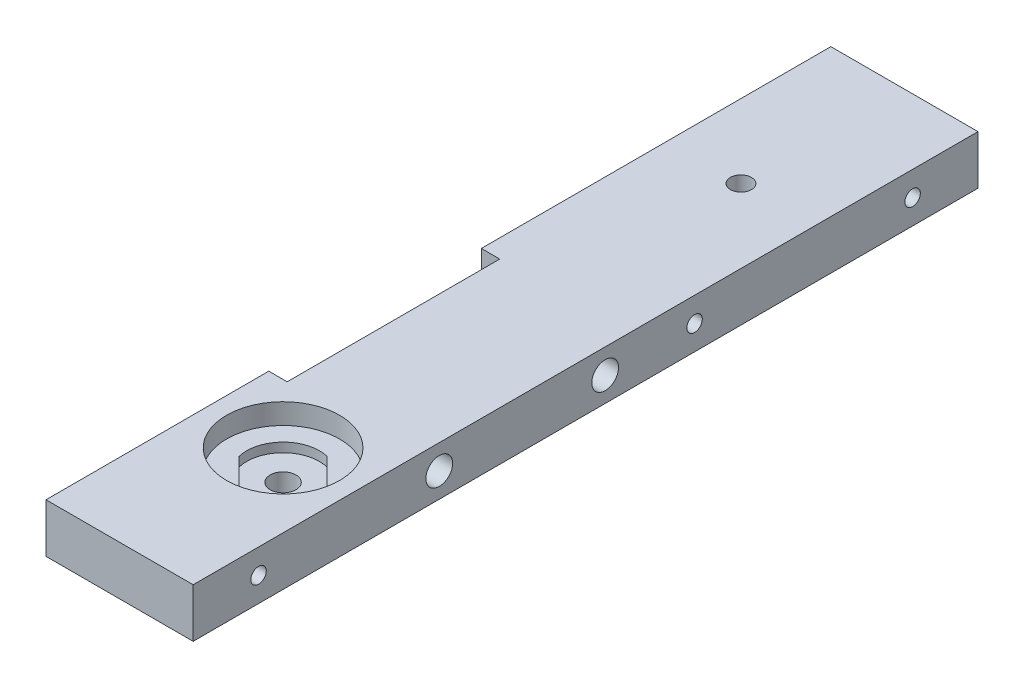
ISO-10303-21;
HEADER;
FILE_DESCRIPTION(('STEP AP214'),'2;1');
FILE_NAME('part.step','',(''),(''),'','','');
FILE_SCHEMA(('AUTOMOTIVE_DESIGN { 1 0 10303 214 1 1 1 1 }'));
ENDSEC;
DATA;
#1=APPLICATION_CONTEXT('core data for automotive mechanical design processes');
#2=APPLICATION_PROTOCOL_DEFINITION('international standard','automotive_design',2000,#1);
#3=PRODUCT_CONTEXT('',#1,'mechanical');
#4=PRODUCT('Part','Part','',(#3));
#5=PRODUCT_RELATED_PRODUCT_CATEGORY('part','',(#4));
#6=PRODUCT_DEFINITION_FORMATION('','',#4);
#7=PRODUCT_DEFINITION_CONTEXT('part definition',#1,'design');
#8=PRODUCT_DEFINITION('design','',#6,#7);
#9=PRODUCT_DEFINITION_SHAPE('','',#8);
#10=(LENGTH_UNIT() NAMED_UNIT(*) SI_UNIT(.MILLI.,.METRE.));
#11=(NAMED_UNIT(*) PLANE_ANGLE_UNIT() SI_UNIT($,.RADIAN.));
#12=(NAMED_UNIT(*) SI_UNIT($,.STERADIAN.) SOLID_ANGLE_UNIT());
#13=UNCERTAINTY_MEASURE_WITH_UNIT(LENGTH_MEASURE(1.E-05),#10,'distance_accuracy_value','');
#14=(GEOMETRIC_REPRESENTATION_CONTEXT(3) GLOBAL_UNCERTAINTY_ASSIGNED_CONTEXT((#13)) GLOBAL_UNIT_ASSIGNED_CONTEXT((#10,
#11,#12)) REPRESENTATION_CONTEXT('',''));
#15=CARTESIAN_POINT('',(0.,0.,0.));
#16=DIRECTION('',(0.,0.,1.));
#17=DIRECTION('',(1.,0.,0.));
#18=AXIS2_PLACEMENT_3D('',#15,#16,#17);
#19=CARTESIAN_POINT('',(-9.3947330579063,6.41589337526267,94.0446449736242));
#20=DIRECTION('',(1.,0.,0.));
#21=DIRECTION('',(0.,0.,-1.));
#22=AXIS2_PLACEMENT_3D('',#19,#20,#21);
#23=PLANE('',#22);
#24=CARTESIAN_POINT('',(-9.3947330579063,1.65339337526267,-45.6553550263758));
#25=DIRECTION('',(-1.,0.,0.));
#26=DIRECTION('',(0.,0.,1.));
#27=AXIS2_PLACEMENT_3D('',#24,#25,#26);
#28=CIRCLE('',#27,1.5);
#29=CARTESIAN_POINT('',(-9.3947330579063,1.65339337526267,-44.1553550263758));
#30=VERTEX_POINT('',#29);
#31=EDGE_CURVE('E239',#30,#30,#28,.T.);
#32=ORIENTED_EDGE('',*,*,#31,.F.);
#33=EDGE_LOOP('',(#32));
#34=FACE_BOUND('',#33,.T.);
#35=CARTESIAN_POINT('',(-9.3947330579063,1.65339337526267,-3.32202169304251));
#36=DIRECTION('',(-1.,0.,0.));
#37=DIRECTION('',(0.,0.,1.));
#38=AXIS2_PLACEMENT_3D('',#35,#36,#37);
#39=CIRCLE('',#38,1.5);
#40=CARTESIAN_POINT('',(-9.3947330579063,1.65339337526267,-1.82202169304251));
#41=VERTEX_POINT('',#40);
#42=EDGE_CURVE('E236',#41,#41,#39,.T.);
#43=ORIENTED_EDGE('',*,*,#42,.F.);
#44=EDGE_LOOP('',(#43));
#45=FACE_BOUND('',#44,.T.);
#46=DIRECTION('',(0.,0.,1.));
#47=VECTOR('',#46,1.);
#48=CARTESIAN_POINT('',(-9.3947330579063,-3.10910662473733,94.0446449736242));
#49=LINE('',#48,#47);
#50=CARTESIAN_POINT('',(-9.3947330579063,-3.10910662473733,-58.3553550263758));
#51=VERTEX_POINT('',#50);
#52=CARTESIAN_POINT('',(-9.3947330579063,-3.10910662473733,9.50964497362418));
#53=VERTEX_POINT('',#52);
#54=EDGE_CURVE('E250',#51,#53,#49,.T.);
#55=ORIENTED_EDGE('',*,*,#54,.T.);
#56=DIRECTION('',(0.,-1.,0.));
#57=VECTOR('',#56,1.);
#58=CARTESIAN_POINT('',(-9.3947330579063,6.41589337526267,9.50964497362418));
#59=LINE('',#58,#57);
#60=CARTESIAN_POINT('',(-9.3947330579063,6.41589337526267,9.50964497362418));
#61=VERTEX_POINT('',#60);
#62=EDGE_CURVE('E181',#61,#53,#59,.T.);
#63=ORIENTED_EDGE('',*,*,#62,.F.);
#64=DIRECTION('',(0.,0.,1.));
#65=VECTOR('',#64,1.);
#66=CARTESIAN_POINT('',(-9.3947330579063,6.41589337526267,94.0446449736242));
#67=LINE('',#66,#65);
#68=CARTESIAN_POINT('',(-9.3947330579063,6.41589337526267,-58.3553550263758));
#69=VERTEX_POINT('',#68);
#70=EDGE_CURVE('E255',#69,#61,#67,.T.);
#71=ORIENTED_EDGE('',*,*,#70,.F.);
#72=DIRECTION('',(0.,-1.,0.));
#73=VECTOR('',#72,1.);
#74=CARTESIAN_POINT('',(-9.3947330579063,6.41589337526267,-58.3553550263758));
#75=LINE('',#74,#73);
#76=EDGE_CURVE('E270',#69,#51,#75,.T.);
#77=ORIENTED_EDGE('',*,*,#76,.T.);
#78=EDGE_LOOP('',(#55,#63,#71,#77));
#79=FACE_BOUND('',#78,.T.);
#80=ADVANCED_FACE('F44',(#34,#45,#79),#23,.F.);
#81=CARTESIAN_POINT('',(19.1802669420937,1.65339337526267,46.2546449736242));
#82=DIRECTION('',(-1.,0.,0.));
#83=DIRECTION('',(0.,0.,1.));
#84=AXIS2_PLACEMENT_3D('',#81,#82,#83);
#85=CYLINDRICAL_SURFACE('',#84,2.6);
#86=CARTESIAN_POINT('',(19.1802669420937,1.65339337526267,46.2546449736242));
#87=DIRECTION('',(-1.,0.,0.));
#88=DIRECTION('',(0.,0.,1.));
#89=AXIS2_PLACEMENT_3D('',#86,#87,#88);
#90=CIRCLE('',#89,2.6);
#91=CARTESIAN_POINT('',(19.1802669420937,1.65339337526267,48.8546449736242));
#92=VERTEX_POINT('',#91);
#93=EDGE_CURVE('E212',#92,#92,#90,.T.);
#94=ORIENTED_EDGE('',*,*,#93,.F.);
#95=EDGE_LOOP('',(#94));
#96=FACE_BOUND('',#95,.T.);
#97=CARTESIAN_POINT('',(-5.81973305790629,1.65339337526267,46.2546449736242));
#98=DIRECTION('',(-1.,0.,0.));
#99=DIRECTION('',(0.,0.,1.));
#100=AXIS2_PLACEMENT_3D('',#97,#98,#99);
#101=CIRCLE('',#100,2.6);
#102=CARTESIAN_POINT('',(-5.81973305790629,1.65339337526267,48.8546449736242));
#103=VERTEX_POINT('',#102);
#104=EDGE_CURVE('E209',#103,#103,#101,.F.);
#105=ORIENTED_EDGE('',*,*,#104,.F.);
#106=EDGE_LOOP('',(#105));
#107=FACE_BOUND('',#106,.T.);
#108=ADVANCED_FACE('F360',(#96,#107),#85,.F.);
#109=CARTESIAN_POINT('',(19.1802669420937,1.65339337526267,14.0446449736242));
#110=DIRECTION('',(-1.,0.,0.));
#111=DIRECTION('',(0.,0.,1.));
#112=AXIS2_PLACEMENT_3D('',#109,#110,#111);
#113=CYLINDRICAL_SURFACE('',#112,2.6);
#114=CARTESIAN_POINT('',(19.1802669420937,1.65339337526267,14.0446449736242));
#115=DIRECTION('',(-1.,0.,0.));
#116=DIRECTION('',(0.,0.,1.));
#117=AXIS2_PLACEMENT_3D('',#114,#115,#116);
#118=CIRCLE('',#117,2.6);
#119=CARTESIAN_POINT('',(19.1802669420937,1.65339337526267,16.6446449736242));
#120=VERTEX_POINT('',#119);
#121=EDGE_CURVE('E213',#120,#120,#118,.T.);
#122=ORIENTED_EDGE('',*,*,#121,.F.);
#123=EDGE_LOOP('',(#122));
#124=FACE_BOUND('',#123,.T.);
#125=CARTESIAN_POINT('',(-5.8197330579063,1.65339337526267,14.0446449736242));
#126=DIRECTION('',(-1.,0.,0.));
#127=DIRECTION('',(0.,0.,1.));
#128=AXIS2_PLACEMENT_3D('',#125,#126,#127);
#129=CIRCLE('',#128,2.6);
#130=CARTESIAN_POINT('',(-5.8197330579063,1.65339337526267,16.6446449736242));
#131=VERTEX_POINT('',#130);
#132=EDGE_CURVE('E208',#131,#131,#129,.F.);
#133=ORIENTED_EDGE('',*,*,#132,.F.);
#134=EDGE_LOOP('',(#133));
#135=FACE_BOUND('',#134,.T.);
#136=ADVANCED_FACE('F368',(#124,#135),#113,.F.);
#137=CARTESIAN_POINT('',(-9.3947330579063,1.65339337526267,81.3446449736242));
#138=DIRECTION('',(-1.,0.,0.));
#139=DIRECTION('',(0.,0.,1.));
#140=AXIS2_PLACEMENT_3D('',#137,#138,#139);
#141=CYLINDRICAL_SURFACE('',#140,1.5);
#142=CARTESIAN_POINT('',(19.1802669420937,1.65339337526267,81.3446449736242));
#143=DIRECTION('',(-1.,0.,0.));
#144=DIRECTION('',(0.,0.,1.));
#145=AXIS2_PLACEMENT_3D('',#142,#143,#144);
#146=CIRCLE('',#145,1.49999999999999);
#147=CARTESIAN_POINT('',(19.1802669420937,1.65339337526267,82.8446449736241));
#148=VERTEX_POINT('',#147);
#149=EDGE_CURVE('E279',#148,#148,#146,.T.);
#150=ORIENTED_EDGE('',*,*,#149,.F.);
#151=EDGE_LOOP('',(#150));
#152=FACE_BOUND('',#151,.T.);
#153=CARTESIAN_POINT('',(-9.3947330579063,1.65339337526267,81.3446449736242));
#154=DIRECTION('',(-1.,0.,0.));
#155=DIRECTION('',(0.,0.,1.));
#156=AXIS2_PLACEMENT_3D('',#153,#154,#155);
#157=CIRCLE('',#156,1.5);
#158=CARTESIAN_POINT('',(-9.3947330579063,1.65339337526267,82.8446449736242));
#159=VERTEX_POINT('',#158);
#160=EDGE_CURVE('E282',#159,#159,#157,.T.);
#161=ORIENTED_EDGE('',*,*,#160,.T.);
#162=EDGE_LOOP('',(#161));
#163=FACE_BOUND('',#162,.T.);
#164=ADVANCED_FACE('F46',(#152,#163),#141,.F.);
#165=CARTESIAN_POINT('',(19.1802669420937,6.41589337526267,94.0446449736242));
#166=DIRECTION('',(0.,0.,-1.));
#167=DIRECTION('',(-1.,0.,0.));
#168=AXIS2_PLACEMENT_3D('',#165,#166,#167);
#169=PLANE('',#168);
#170=DIRECTION('',(1.,0.,0.));
#171=VECTOR('',#170,1.);
#172=CARTESIAN_POINT('',(19.1802669420937,-3.10910662473733,94.0446449736242));
#173=LINE('',#172,#171);
#174=CARTESIAN_POINT('',(-9.3947330579063,-3.10910662473733,94.0446449736242));
#175=VERTEX_POINT('',#174);
#176=CARTESIAN_POINT('',(19.1802669420937,-3.10910662473733,94.0446449736242));
#177=VERTEX_POINT('',#176);
#178=EDGE_CURVE('E245',#175,#177,#173,.T.);
#179=ORIENTED_EDGE('',*,*,#178,.T.);
#180=DIRECTION('',(0.,-1.,0.));
#181=VECTOR('',#180,1.);
#182=CARTESIAN_POINT('',(19.1802669420937,6.41589337526267,94.0446449736242));
#183=LINE('',#182,#181);
#184=CARTESIAN_POINT('',(19.1802669420937,6.41589337526267,94.0446449736242));
#185=VERTEX_POINT('',#184);
#186=EDGE_CURVE('E276',#185,#177,#183,.T.);
#187=ORIENTED_EDGE('',*,*,#186,.F.);
#188=DIRECTION('',(1.,0.,0.));
#189=VECTOR('',#188,1.);
#190=CARTESIAN_POINT('',(19.1802669420937,6.41589337526267,94.0446449736242));
#191=LINE('',#190,#189);
#192=CARTESIAN_POINT('',(-9.3947330579063,6.41589337526267,94.0446449736242));
#193=VERTEX_POINT('',#192);
#194=EDGE_CURVE('E246',#193,#185,#191,.T.);
#195=ORIENTED_EDGE('',*,*,#194,.F.);
#196=DIRECTION('',(0.,-1.,0.));
#197=VECTOR('',#196,1.);
#198=CARTESIAN_POINT('',(-9.3947330579063,6.41589337526267,94.0446449736242));
#199=LINE('',#198,#197);
#200=EDGE_CURVE('E258',#193,#175,#199,.T.);
#201=ORIENTED_EDGE('',*,*,#200,.T.);
#202=EDGE_LOOP('',(#179,#187,#195,#201));
#203=FACE_BOUND('',#202,.T.);
#204=ADVANCED_FACE('F394',(#203),#169,.F.);
#205=CARTESIAN_POINT('',(19.1802669420937,6.41589337526267,-58.3553550263758));
#206=DIRECTION('',(-1.,0.,0.));
#207=DIRECTION('',(0.,0.,1.));
#208=AXIS2_PLACEMENT_3D('',#205,#206,#207);
#209=PLANE('',#208);
#210=ORIENTED_EDGE('',*,*,#121,.T.);
#211=EDGE_LOOP('',(#210));
#212=FACE_BOUND('',#211,.T.);
#213=ORIENTED_EDGE('',*,*,#93,.T.);
#214=EDGE_LOOP('',(#213));
#215=FACE_BOUND('',#214,.T.);
#216=CARTESIAN_POINT('',(19.1802669420937,1.65339337526267,-3.32202169304251));
#217=DIRECTION('',(-1.,0.,0.));
#218=DIRECTION('',(0.,0.,1.));
#219=AXIS2_PLACEMENT_3D('',#216,#217,#218);
#220=CIRCLE('',#219,1.49999999999999);
#221=CARTESIAN_POINT('',(19.1802669420937,1.65339337526267,-1.82202169304251));
#222=VERTEX_POINT('',#221);
#223=EDGE_CURVE('E231',#222,#222,#220,.T.);
#224=ORIENTED_EDGE('',*,*,#223,.T.);
#225=EDGE_LOOP('',(#224));
#226=FACE_BOUND('',#225,.T.);
#227=CARTESIAN_POINT('',(19.1802669420937,1.65339337526267,-45.6553550263758));
#228=DIRECTION('',(-1.,0.,0.));
#229=DIRECTION('',(0.,0.,1.));
#230=AXIS2_PLACEMENT_3D('',#227,#228,#229);
#231=CIRCLE('',#230,1.49999999999999);
#232=CARTESIAN_POINT('',(19.1802669420937,1.65339337526267,-44.1553550263758));
#233=VERTEX_POINT('',#232);
#234=EDGE_CURVE('E242',#233,#233,#231,.T.);
#235=ORIENTED_EDGE('',*,*,#234,.T.);
#236=EDGE_LOOP('',(#235));
#237=FACE_BOUND('',#236,.T.);
#238=DIRECTION('',(0.,0.,-1.));
#239=VECTOR('',#238,1.);
#240=CARTESIAN_POINT('',(19.1802669420937,-3.10910662473733,-58.3553550263758));
#241=LINE('',#240,#239);
#242=CARTESIAN_POINT('',(19.1802669420937,-3.10910662473733,-58.3553550263758));
#243=VERTEX_POINT('',#242);
#244=EDGE_CURVE('E261',#177,#243,#241,.T.);
#245=ORIENTED_EDGE('',*,*,#244,.T.);
#246=DIRECTION('',(0.,-1.,0.));
#247=VECTOR('',#246,1.);
#248=CARTESIAN_POINT('',(19.1802669420937,6.41589337526267,-58.3553550263758));
#249=LINE('',#248,#247);
#250=CARTESIAN_POINT('',(19.1802669420937,6.41589337526267,-58.3553550263758));
#251=VERTEX_POINT('',#250);
#252=EDGE_CURVE('E273',#251,#243,#249,.T.);
#253=ORIENTED_EDGE('',*,*,#252,.F.);
#254=DIRECTION('',(0.,0.,-1.));
#255=VECTOR('',#254,1.);
#256=CARTESIAN_POINT('',(19.1802669420937,6.41589337526267,-58.3553550263758));
#257=LINE('',#256,#255);
#258=EDGE_CURVE('E249',#185,#251,#257,.T.);
#259=ORIENTED_EDGE('',*,*,#258,.F.);
#260=ORIENTED_EDGE('',*,*,#186,.T.);
#261=EDGE_LOOP('',(#245,#253,#259,#260));
#262=FACE_BOUND('',#261,.T.);
#263=ORIENTED_EDGE('',*,*,#149,.T.);
#264=EDGE_LOOP('',(#263));
#265=FACE_BOUND('',#264,.T.);
#266=ADVANCED_FACE('F386',(#212,#215,#226,#237,#262,#265),#209,.F.);
#267=CARTESIAN_POINT('',(-9.3947330579063,6.41589337526267,-58.3553550263758));
#268=DIRECTION('',(0.,0.,1.));
#269=DIRECTION('',(1.,0.,0.));
#270=AXIS2_PLACEMENT_3D('',#267,#268,#269);
#271=PLANE('',#270);
#272=DIRECTION('',(-1.,0.,0.));
#273=VECTOR('',#272,1.);
#274=CARTESIAN_POINT('',(-9.3947330579063,-3.10910662473733,-58.3553550263758));
#275=LINE('',#274,#273);
#276=EDGE_CURVE('E263',#243,#51,#275,.T.);
#277=ORIENTED_EDGE('',*,*,#276,.T.);
#278=ORIENTED_EDGE('',*,*,#76,.F.);
#279=DIRECTION('',(-1.,0.,0.));
#280=VECTOR('',#279,1.);
#281=CARTESIAN_POINT('',(-9.3947330579063,6.41589337526267,-58.3553550263758));
#282=LINE('',#281,#280);
#283=EDGE_CURVE('E252',#251,#69,#282,.T.);
#284=ORIENTED_EDGE('',*,*,#283,.F.);
#285=ORIENTED_EDGE('',*,*,#252,.T.);
#286=EDGE_LOOP('',(#277,#278,#284,#285));
#287=FACE_BOUND('',#286,.T.);
#288=ADVANCED_FACE('F377',(#287),#271,.F.);
#289=CARTESIAN_POINT('',(-9.3947330579063,6.41589337526267,50.7896449736242));
#290=VERTEX_POINT('',#289);
#291=EDGE_CURVE('E254',#290,#193,#67,.T.);
#292=ORIENTED_EDGE('',*,*,#291,.F.);
#293=DIRECTION('',(0.,1.,0.));
#294=VECTOR('',#293,1.);
#295=CARTESIAN_POINT('',(-9.3947330579063,6.41589337526267,50.7896449736242));
#296=LINE('',#295,#294);
#297=CARTESIAN_POINT('',(-9.3947330579063,-3.10910662473733,50.7896449736242));
#298=VERTEX_POINT('',#297);
#299=EDGE_CURVE('E197',#298,#290,#296,.T.);
#300=ORIENTED_EDGE('',*,*,#299,.F.);
#301=EDGE_CURVE('E265',#298,#175,#49,.T.);
#302=ORIENTED_EDGE('',*,*,#301,.T.);
#303=ORIENTED_EDGE('',*,*,#200,.F.);
#304=EDGE_LOOP('',(#292,#300,#302,#303));
#305=FACE_BOUND('',#304,.T.);
#306=ORIENTED_EDGE('',*,*,#160,.F.);
#307=EDGE_LOOP('',(#306));
#308=FACE_BOUND('',#307,.T.);
#309=ADVANCED_FACE('F363',(#305,#308),#23,.F.);
#310=CARTESIAN_POINT('',(-9.3947330579063,6.41589337526267,94.0446449736242));
#311=DIRECTION('',(0.,-1.,0.));
#312=DIRECTION('',(0.,0.,-1.));
#313=AXIS2_PLACEMENT_3D('',#310,#311,#312);
#314=PLANE('',#313);
#315=ORIENTED_EDGE('',*,*,#70,.T.);
#316=DIRECTION('',(-1.,0.,0.));
#317=VECTOR('',#316,1.);
#318=CARTESIAN_POINT('',(61.5449223165919,6.41589337526267,9.50964497362418));
#319=LINE('',#318,#317);
#320=CARTESIAN_POINT('',(-5.81973305790629,6.41589337526267,9.50964497362418));
#321=VERTEX_POINT('',#320);
#322=EDGE_CURVE('E190',#321,#61,#319,.T.);
#323=ORIENTED_EDGE('',*,*,#322,.F.);
#324=DIRECTION('',(0.,0.,1.));
#325=VECTOR('',#324,1.);
#326=CARTESIAN_POINT('',(-5.81973305790629,6.41589337526267,9.50964497362419));
#327=LINE('',#326,#325);
#328=CARTESIAN_POINT('',(-5.81973305790629,6.41589337526267,50.7896449736242));
#329=VERTEX_POINT('',#328);
#330=EDGE_CURVE('E189',#321,#329,#327,.T.);
#331=ORIENTED_EDGE('',*,*,#330,.T.);
#332=DIRECTION('',(-1.,0.,0.));
#333=VECTOR('',#332,1.);
#334=CARTESIAN_POINT('',(61.5449223165919,6.41589337526267,50.7896449736242));
#335=LINE('',#334,#333);
#336=EDGE_CURVE('E200',#329,#290,#335,.T.);
#337=ORIENTED_EDGE('',*,*,#336,.T.);
#338=ORIENTED_EDGE('',*,*,#291,.T.);
#339=ORIENTED_EDGE('',*,*,#194,.T.);
#340=ORIENTED_EDGE('',*,*,#258,.T.);
#341=ORIENTED_EDGE('',*,*,#283,.T.);
#342=EDGE_LOOP('',(#315,#323,#331,#337,#338,#339,#340,#341));
#343=FACE_BOUND('',#342,.T.);
#344=CARTESIAN_POINT('',(4.89276694209372,6.41589337526267,62.2946449736242));
#345=DIRECTION('',(0.,1.,0.));
#346=DIRECTION('',(0.,0.,1.));
#347=AXIS2_PLACEMENT_3D('',#344,#345,#346);
#348=CIRCLE('',#347,10.975);
#349=CARTESIAN_POINT('',(4.89276694209372,6.41589337526267,73.2696449736242));
#350=VERTEX_POINT('',#349);
#351=EDGE_CURVE('E221',#350,#350,#348,.T.);
#352=ORIENTED_EDGE('',*,*,#351,.F.);
#353=EDGE_LOOP('',(#352));
#354=FACE_BOUND('',#353,.T.);
#355=CARTESIAN_POINT('',(4.89276694209372,6.41589337526267,-26.6053550263758));
#356=DIRECTION('',(0.,1.,0.));
#357=DIRECTION('',(0.,0.,1.));
#358=AXIS2_PLACEMENT_3D('',#355,#356,#357);
#359=CIRCLE('',#358,2.05);
#360=CARTESIAN_POINT('',(4.89276694209372,6.41589337526267,-24.5553550263758));
#361=VERTEX_POINT('',#360);
#362=EDGE_CURVE('E225',#361,#361,#359,.T.);
#363=ORIENTED_EDGE('',*,*,#362,.F.);
#364=EDGE_LOOP('',(#363));
#365=FACE_BOUND('',#364,.T.);
#366=ADVANCED_FACE('F376',(#343,#354,#365),#314,.F.);
#367=CARTESIAN_POINT('',(-9.3947330579063,-3.10910662473733,94.0446449736242));
#368=DIRECTION('',(0.,-1.,0.));
#369=DIRECTION('',(0.,0.,-1.));
#370=AXIS2_PLACEMENT_3D('',#367,#368,#369);
#371=PLANE('',#370);
#372=DIRECTION('',(-1.,0.,0.));
#373=VECTOR('',#372,1.);
#374=CARTESIAN_POINT('',(61.5449223165919,-3.10910662473733,9.50964497362418));
#375=LINE('',#374,#373);
#376=CARTESIAN_POINT('',(-5.81973305790629,-3.10910662473733,9.50964497362418));
#377=VERTEX_POINT('',#376);
#378=EDGE_CURVE('E67',#377,#53,#375,.T.);
#379=ORIENTED_EDGE('',*,*,#378,.T.);
#380=ORIENTED_EDGE('',*,*,#54,.F.);
#381=ORIENTED_EDGE('',*,*,#276,.F.);
#382=ORIENTED_EDGE('',*,*,#244,.F.);
#383=ORIENTED_EDGE('',*,*,#178,.F.);
#384=ORIENTED_EDGE('',*,*,#301,.F.);
#385=DIRECTION('',(-1.,0.,0.));
#386=VECTOR('',#385,1.);
#387=CARTESIAN_POINT('',(61.5449223165919,-3.10910662473733,50.7896449736242));
#388=LINE('',#387,#386);
#389=CARTESIAN_POINT('',(-5.81973305790629,-3.10910662473733,50.7896449736242));
#390=VERTEX_POINT('',#389);
#391=EDGE_CURVE('E203',#390,#298,#388,.T.);
#392=ORIENTED_EDGE('',*,*,#391,.F.);
#393=DIRECTION('',(0.,0.,-1.));
#394=VECTOR('',#393,1.);
#395=CARTESIAN_POINT('',(-5.81973305790629,-3.10910662473733,9.50964497362419));
#396=LINE('',#395,#394);
#397=EDGE_CURVE('E195',#390,#377,#396,.T.);
#398=ORIENTED_EDGE('',*,*,#397,.T.);
#399=EDGE_LOOP('',(#379,#380,#381,#382,#383,#384,#392,#398));
#400=FACE_BOUND('',#399,.T.);
#401=CARTESIAN_POINT('',(4.89276694209372,-3.10910662473733,62.2946449736242));
#402=DIRECTION('',(0.,1.,0.));
#403=DIRECTION('',(0.,0.,1.));
#404=AXIS2_PLACEMENT_3D('',#401,#402,#403);
#405=CIRCLE('',#404,2.5);
#406=CARTESIAN_POINT('',(4.89276694209372,-3.10910662473733,64.7946449736242));
#407=VERTEX_POINT('',#406);
#408=EDGE_CURVE('E216',#407,#407,#405,.T.);
#409=ORIENTED_EDGE('',*,*,#408,.T.);
#410=EDGE_LOOP('',(#409));
#411=FACE_BOUND('',#410,.T.);
#412=CARTESIAN_POINT('',(4.89276694209372,-3.10910662473733,-26.6053550263758));
#413=DIRECTION('',(0.,1.,0.));
#414=DIRECTION('',(0.,0.,1.));
#415=AXIS2_PLACEMENT_3D('',#412,#413,#414);
#416=CIRCLE('',#415,2.05);
#417=CARTESIAN_POINT('',(4.89276694209372,-3.10910662473733,-24.5553550263758));
#418=VERTEX_POINT('',#417);
#419=EDGE_CURVE('E228',#418,#418,#416,.T.);
#420=ORIENTED_EDGE('',*,*,#419,.T.);
#421=EDGE_LOOP('',(#420));
#422=FACE_BOUND('',#421,.T.);
#423=ADVANCED_FACE('F383',(#400,#411,#422),#371,.T.);
#424=CARTESIAN_POINT('',(-9.3947330579063,1.65339337526267,-45.6553550263758));
#425=DIRECTION('',(-1.,0.,0.));
#426=DIRECTION('',(0.,0.,1.));
#427=AXIS2_PLACEMENT_3D('',#424,#425,#426);
#428=CYLINDRICAL_SURFACE('',#427,1.5);
#429=ORIENTED_EDGE('',*,*,#234,.F.);
#430=EDGE_LOOP('',(#429));
#431=FACE_BOUND('',#430,.T.);
#432=ORIENTED_EDGE('',*,*,#31,.T.);
#433=EDGE_LOOP('',(#432));
#434=FACE_BOUND('',#433,.T.);
#435=ADVANCED_FACE('F470',(#431,#434),#428,.F.);
#436=CARTESIAN_POINT('',(-9.3947330579063,1.65339337526267,-3.32202169304251));
#437=DIRECTION('',(-1.,0.,0.));
#438=DIRECTION('',(0.,0.,1.));
#439=AXIS2_PLACEMENT_3D('',#436,#437,#438);
#440=CYLINDRICAL_SURFACE('',#439,1.5);
#441=ORIENTED_EDGE('',*,*,#223,.F.);
#442=EDGE_LOOP('',(#441));
#443=FACE_BOUND('',#442,.T.);
#444=ORIENTED_EDGE('',*,*,#42,.T.);
#445=EDGE_LOOP('',(#444));
#446=FACE_BOUND('',#445,.T.);
#447=ADVANCED_FACE('F466',(#443,#446),#440,.F.);
#448=CARTESIAN_POINT('',(4.89276694209372,-3.10910662473733,-26.6053550263758));
#449=DIRECTION('',(0.,1.,0.));
#450=DIRECTION('',(0.,0.,1.));
#451=AXIS2_PLACEMENT_3D('',#448,#449,#450);
#452=CYLINDRICAL_SURFACE('',#451,2.05);
#453=CARTESIAN_POINT('',(4.89276694209372,-3.10910662473733,-24.5553550263758));
#454=CARTESIAN_POINT('',(4.89276694209372,-3.00988787473733,-24.5553550263758));
#455=CARTESIAN_POINT('',(4.89276694209372,-2.91066912473733,-24.5553550263758));
#456=CARTESIAN_POINT('',(4.89276694209372,-2.71223162473733,-24.5553550263758));
#457=CARTESIAN_POINT('',(4.89276694209372,-2.61301287473733,-24.5553550263758));
#458=CARTESIAN_POINT('',(4.89276694209372,-2.41457537473733,-24.5553550263758));
#459=CARTESIAN_POINT('',(4.89276694209372,-2.31535662473733,-24.5553550263758));
#460=CARTESIAN_POINT('',(4.89276694209372,-2.11691912473733,-24.5553550263758));
#461=CARTESIAN_POINT('',(4.89276694209372,-2.01770037473733,-24.5553550263758));
#462=CARTESIAN_POINT('',(4.89276694209372,-1.81926287473733,-24.5553550263758));
#463=CARTESIAN_POINT('',(4.89276694209372,-1.72004412473733,-24.5553550263758));
#464=CARTESIAN_POINT('',(4.89276694209372,-1.52160662473733,-24.5553550263758));
#465=CARTESIAN_POINT('',(4.89276694209372,-1.42238787473733,-24.5553550263758));
#466=CARTESIAN_POINT('',(4.89276694209372,-1.22395037473733,-24.5553550263758));
#467=CARTESIAN_POINT('',(4.89276694209372,-1.12473162473733,-24.5553550263758));
#468=CARTESIAN_POINT('',(4.89276694209372,-0.92629412473733,-24.5553550263758));
#469=CARTESIAN_POINT('',(4.89276694209372,-0.827075374737329,-24.5553550263758));
#470=CARTESIAN_POINT('',(4.89276694209372,-0.628637874737329,-24.5553550263758));
#471=CARTESIAN_POINT('',(4.89276694209372,-0.529419124737329,-24.5553550263758));
#472=CARTESIAN_POINT('',(4.89276694209372,-0.330981624737329,-24.5553550263758));
#473=CARTESIAN_POINT('',(4.89276694209372,-0.231762874737329,-24.5553550263758));
#474=CARTESIAN_POINT('',(4.89276694209372,-0.0333253747373291,-24.5553550263758));
#475=CARTESIAN_POINT('',(4.89276694209372,0.0658933752626708,-24.5553550263758));
#476=CARTESIAN_POINT('',(4.89276694209372,0.264330875262671,-24.5553550263758));
#477=CARTESIAN_POINT('',(4.89276694209372,0.363549625262671,-24.5553550263758));
#478=CARTESIAN_POINT('',(4.89276694209372,0.561987125262671,-24.5553550263758));
#479=CARTESIAN_POINT('',(4.89276694209372,0.661205875262671,-24.5553550263758));
#480=CARTESIAN_POINT('',(4.89276694209372,0.859643375262671,-24.5553550263758));
#481=CARTESIAN_POINT('',(4.89276694209372,0.958862125262671,-24.5553550263758));
#482=CARTESIAN_POINT('',(4.89276694209372,1.15729962526267,-24.5553550263758));
#483=CARTESIAN_POINT('',(4.89276694209372,1.25651837526267,-24.5553550263758));
#484=CARTESIAN_POINT('',(4.89276694209372,1.45495587526267,-24.5553550263758));
#485=CARTESIAN_POINT('',(4.89276694209372,1.55417462526267,-24.5553550263758));
#486=CARTESIAN_POINT('',(4.89276694209372,1.75261212526267,-24.5553550263758));
#487=CARTESIAN_POINT('',(4.89276694209372,1.85183087526267,-24.5553550263758));
#488=CARTESIAN_POINT('',(4.89276694209372,2.05026837526267,-24.5553550263758));
#489=CARTESIAN_POINT('',(4.89276694209372,2.14948712526267,-24.5553550263758));
#490=CARTESIAN_POINT('',(4.89276694209372,2.34792462526267,-24.5553550263758));
#491=CARTESIAN_POINT('',(4.89276694209372,2.44714337526267,-24.5553550263758));
#492=CARTESIAN_POINT('',(4.89276694209372,2.64558087526267,-24.5553550263758));
#493=CARTESIAN_POINT('',(4.89276694209372,2.74479962526267,-24.5553550263758));
#494=CARTESIAN_POINT('',(4.89276694209372,2.94323712526267,-24.5553550263758));
#495=CARTESIAN_POINT('',(4.89276694209372,3.04245587526267,-24.5553550263758));
#496=CARTESIAN_POINT('',(4.89276694209372,3.24089337526267,-24.5553550263758));
#497=CARTESIAN_POINT('',(4.89276694209372,3.34011212526267,-24.5553550263758));
#498=CARTESIAN_POINT('',(4.89276694209372,3.53854962526267,-24.5553550263758));
#499=CARTESIAN_POINT('',(4.89276694209372,3.63776837526267,-24.5553550263758));
#500=CARTESIAN_POINT('',(4.89276694209372,3.83620587526267,-24.5553550263758));
#501=CARTESIAN_POINT('',(4.89276694209372,3.93542462526267,-24.5553550263758));
#502=CARTESIAN_POINT('',(4.89276694209372,4.13386212526267,-24.5553550263758));
#503=CARTESIAN_POINT('',(4.89276694209372,4.23308087526267,-24.5553550263758));
#504=CARTESIAN_POINT('',(4.89276694209372,4.43151837526267,-24.5553550263758));
#505=CARTESIAN_POINT('',(4.89276694209372,4.53073712526267,-24.5553550263758));
#506=CARTESIAN_POINT('',(4.89276694209372,4.72917462526267,-24.5553550263758));
#507=CARTESIAN_POINT('',(4.89276694209372,4.82839337526267,-24.5553550263758));
#508=CARTESIAN_POINT('',(4.89276694209372,5.02683087526267,-24.5553550263758));
#509=CARTESIAN_POINT('',(4.89276694209372,5.12604962526267,-24.5553550263758));
#510=CARTESIAN_POINT('',(4.89276694209372,5.32448712526267,-24.5553550263758));
#511=CARTESIAN_POINT('',(4.89276694209372,5.42370587526267,-24.5553550263758));
#512=CARTESIAN_POINT('',(4.89276694209372,5.62214337526267,-24.5553550263758));
#513=CARTESIAN_POINT('',(4.89276694209372,5.72136212526267,-24.5553550263758));
#514=CARTESIAN_POINT('',(4.89276694209372,5.91979962526267,-24.5553550263758));
#515=CARTESIAN_POINT('',(4.89276694209372,6.01901837526267,-24.5553550263758));
#516=CARTESIAN_POINT('',(4.89276694209372,6.21745587526267,-24.5553550263758));
#517=CARTESIAN_POINT('',(4.89276694209372,6.31667462526267,-24.5553550263758));
#518=CARTESIAN_POINT('',(4.89276694209372,6.41589337526267,-24.5553550263758));
#519=B_SPLINE_CURVE_WITH_KNOTS('',3,(#453,#454,#455,#456,#457,#458,#459,#460,#461,#462,#463,
#464,#465,#466,#467,#468,#469,#470,#471,#472,#473,#474,#475,#476,#477,#478,#479,#480,#481,#482,
#483,#484,#485,#486,#487,#488,#489,#490,#491,#492,#493,#494,#495,#496,#497,#498,#499,#500,#501,
#502,#503,#504,#505,#506,#507,#508,#509,#510,#511,#512,#513,#514,#515,#516,#517,#518),
.UNSPECIFIED.,.F.,.F.,(4,2,2,2,2,2,2,2,2,2,2,2,2,2,2,2,2,2,2,2,2,2,2,2,2,2,2,2,2,2,2,2,4),(0.,
0.29765625,0.5953125,0.89296875,1.190625,1.48828125,1.7859375,2.08359375,2.38125,2.67890625,
2.9765625,3.27421875,3.571875,3.86953125,4.1671875,4.46484375,4.7625,5.06015625,5.3578125,
5.65546875,5.953125,6.25078125,6.5484375,6.84609375,7.14375,7.44140625,7.7390625,8.03671875,
8.334375,8.63203125,8.9296875,9.22734375,9.525),.UNSPECIFIED.);
#520=EDGE_CURVE('BSEAM462',#418,#361,#519,.T.);
#521=ORIENTED_EDGE('',*,*,#419,.F.);
#522=ORIENTED_EDGE('',*,*,#362,.T.);
#523=ORIENTED_EDGE('',*,*,#520,.T.);
#524=ORIENTED_EDGE('',*,*,#520,.F.);
#525=EDGE_LOOP('',(#521,#523,#522,#524));
#526=FACE_BOUND('',#525,.T.);
#527=ADVANCED_FACE('F462',(#526),#452,.F.);
#528=CARTESIAN_POINT('',(4.89276694209372,2.41589337526267,62.2946449736242));
#529=DIRECTION('',(0.,1.,0.));
#530=DIRECTION('',(0.,0.,1.));
#531=AXIS2_PLACEMENT_3D('',#528,#529,#530);
#532=CYLINDRICAL_SURFACE('',#531,10.975);
#533=CARTESIAN_POINT('',(4.89276694209372,2.41589337526267,62.2946449736242));
#534=DIRECTION('',(0.,1.,0.));
#535=DIRECTION('',(0.,0.,1.));
#536=AXIS2_PLACEMENT_3D('',#533,#534,#535);
#537=CIRCLE('',#536,10.975);
#538=CARTESIAN_POINT('',(4.89276694209372,2.41589337526267,73.2696449736242));
#539=VERTEX_POINT('',#538);
#540=EDGE_CURVE('E222',#539,#539,#537,.T.);
#541=ORIENTED_EDGE('',*,*,#540,.F.);
#542=EDGE_LOOP('',(#541));
#543=FACE_BOUND('',#542,.T.);
#544=ORIENTED_EDGE('',*,*,#351,.T.);
#545=EDGE_LOOP('',(#544));
#546=FACE_BOUND('',#545,.T.);
#547=ADVANCED_FACE('F459',(#543,#546),#532,.F.);
#548=CARTESIAN_POINT('',(4.89276694209372,2.41589337526267,62.2946449736242));
#549=DIRECTION('',(0.,1.,0.));
#550=DIRECTION('',(0.,0.,1.));
#551=AXIS2_PLACEMENT_3D('',#548,#549,#550);
#552=PLANE('',#551);
#553=CARTESIAN_POINT('',(4.89276694209227,2.41589337526267,62.2946449736227));
#554=DIRECTION('',(0.,1.,0.));
#555=DIRECTION('',(0.,0.,1.));
#556=AXIS2_PLACEMENT_3D('',#553,#554,#555);
#557=CIRCLE('',#556,7.05000000000104);
#558=CARTESIAN_POINT('',(11.7436124735485,2.41589337526267,60.6307893596524));
#559=VERTEX_POINT('',#558);
#560=CARTESIAN_POINT('',(3.22891132812189,2.41589337526267,69.145490505079));
#561=VERTEX_POINT('',#560);
#562=EDGE_CURVE('E285',#559,#561,#557,.F.);
#563=ORIENTED_EDGE('',*,*,#562,.T.);
#564=CARTESIAN_POINT('',(3.27611290582279,2.41589337526267,68.951140277237));
#565=DIRECTION('',(0.,1.,0.));
#566=DIRECTION('',(0.,0.,1.));
#567=AXIS2_PLACEMENT_3D('',#564,#565,#566);
#568=CIRCLE('',#567,0.1999999999992);
#569=CARTESIAN_POINT('',(3.13469154958591,2.41589337526267,69.0925616334736));
#570=VERTEX_POINT('',#569);
#571=EDGE_CURVE('E12',#561,#570,#568,.F.);
#572=ORIENTED_EDGE('',*,*,#571,.T.);
#573=DIRECTION('',(-0.707106781186548,0.,-0.707106781186547));
#574=VECTOR('',#573,1.);
#575=CARTESIAN_POINT('',(0.614770915915102,2.41589337526267,66.5726409998028));
#576=LINE('',#575,#574);
#577=CARTESIAN_POINT('',(-1.90514971775577,2.41589337526267,64.0527203661319));
#578=VERTEX_POINT('',#577);
#579=EDGE_CURVE('E52',#570,#578,#576,.T.);
#580=ORIENTED_EDGE('',*,*,#579,.T.);
#581=CARTESIAN_POINT('',(-1.76629722883476,2.41589337526267,63.912742095948));
#582=DIRECTION('',(0.,1.,0.));
#583=DIRECTION('',(0.,0.,1.));
#584=AXIS2_PLACEMENT_3D('',#581,#582,#583);
#585=CIRCLE('',#584,0.197164727583908);
#586=CARTESIAN_POINT('',(-1.95807858936113,2.41589337526267,63.9585005875959));
#587=VERTEX_POINT('',#586);
#588=EDGE_CURVE('E302',#578,#587,#585,.F.);
#589=ORIENTED_EDGE('',*,*,#588,.T.);
#590=CARTESIAN_POINT('',(4.91639302117545,2.41589337526267,62.3182710527059));
#591=DIRECTION('',(0.,1.,0.));
#592=DIRECTION('',(0.,0.,1.));
#593=AXIS2_PLACEMENT_3D('',#590,#591,#592);
#594=CIRCLE('',#593,7.06744033234092);
#595=CARTESIAN_POINT('',(6.55662255606548,2.41589337526267,55.4437994421693));
#596=VERTEX_POINT('',#595);
#597=EDGE_CURVE('E299',#587,#596,#594,.F.);
#598=ORIENTED_EDGE('',*,*,#597,.T.);
#599=CARTESIAN_POINT('',(6.5108640644171,2.41589337526267,55.6355808026965));
#600=DIRECTION('',(0.,1.,0.));
#601=DIRECTION('',(0.,0.,1.));
#602=AXIS2_PLACEMENT_3D('',#599,#600,#601);
#603=CIRCLE('',#602,0.197164727584812);
#604=CARTESIAN_POINT('',(6.65084233460147,2.41589337526267,55.4967283137747));
#605=VERTEX_POINT('',#604);
#606=EDGE_CURVE('E296',#596,#605,#603,.F.);
#607=ORIENTED_EDGE('',*,*,#606,.T.);
#608=DIRECTION('',(0.707106781186548,0.,0.707106781186547));
#609=VECTOR('',#608,1.);
#610=CARTESIAN_POINT('',(9.17076296827232,2.41589337526267,58.0166489474456));
#611=LINE('',#610,#609);
#612=CARTESIAN_POINT('',(11.6906836019431,2.41589337526267,60.5365695811164));
#613=VERTEX_POINT('',#612);
#614=EDGE_CURVE('E293',#605,#613,#611,.T.);
#615=ORIENTED_EDGE('',*,*,#614,.T.);
#616=CARTESIAN_POINT('',(11.5492622457059,2.41589337526267,60.6779909373536));
#617=DIRECTION('',(0.,1.,0.));
#618=DIRECTION('',(0.,0.,1.));
#619=AXIS2_PLACEMENT_3D('',#616,#617,#618);
#620=CIRCLE('',#619,0.199999999999949);
#621=EDGE_CURVE('E290',#613,#559,#620,.F.);
#622=ORIENTED_EDGE('',*,*,#621,.T.);
#623=EDGE_LOOP('',(#563,#572,#580,#589,#598,#607,#615,#622));
#624=FACE_BOUND('',#623,.T.);
#625=ORIENTED_EDGE('',*,*,#540,.T.);
#626=EDGE_LOOP('',(#625));
#627=FACE_BOUND('',#626,.T.);
#628=ADVANCED_FACE('F305',(#624,#627),#552,.T.);
#629=CARTESIAN_POINT('',(4.89276694209372,-3.10910662473733,62.2946449736242));
#630=DIRECTION('',(0.,1.,0.));
#631=DIRECTION('',(0.,0.,1.));
#632=AXIS2_PLACEMENT_3D('',#629,#630,#631);
#633=CYLINDRICAL_SURFACE('',#632,2.5);
#634=CARTESIAN_POINT('',(4.89276694209372,0.615893375262676,62.2946449736242));
#635=DIRECTION('',(0.,-1.,0.));
#636=DIRECTION('',(1.,0.,0.));
#637=AXIS2_PLACEMENT_3D('',#634,#635,#636);
#638=CIRCLE('',#637,2.5);
#639=CARTESIAN_POINT('',(7.39276694209372,0.615893375262671,62.2946449736242));
#640=VERTEX_POINT('',#639);
#641=EDGE_CURVE('E177',#640,#640,#638,.F.);
#642=ORIENTED_EDGE('',*,*,#641,.T.);
#643=EDGE_LOOP('',(#642));
#644=FACE_BOUND('',#643,.T.);
#645=ORIENTED_EDGE('',*,*,#408,.F.);
#646=EDGE_LOOP('',(#645));
#647=FACE_BOUND('',#646,.T.);
#648=ADVANCED_FACE('F451',(#644,#647),#633,.F.);
#649=CARTESIAN_POINT('',(-5.8197330579063,6.41589337526267,-58.3553550263758));
#650=DIRECTION('',(-1.,0.,0.));
#651=DIRECTION('',(0.,0.,1.));
#652=AXIS2_PLACEMENT_3D('',#649,#650,#651);
#653=PLANE('',#652);
#654=DIRECTION('',(0.,1.,0.));
#655=VECTOR('',#654,1.);
#656=CARTESIAN_POINT('',(-5.81973305790629,6.41589337526267,9.50964497362418));
#657=LINE('',#656,#655);
#658=EDGE_CURVE('E193',#377,#321,#657,.T.);
#659=ORIENTED_EDGE('',*,*,#658,.F.);
#660=ORIENTED_EDGE('',*,*,#397,.F.);
#661=DIRECTION('',(0.,-1.,0.));
#662=VECTOR('',#661,1.);
#663=CARTESIAN_POINT('',(-5.81973305790629,6.41589337526267,50.7896449736242));
#664=LINE('',#663,#662);
#665=EDGE_CURVE('E187',#329,#390,#664,.T.);
#666=ORIENTED_EDGE('',*,*,#665,.F.);
#667=ORIENTED_EDGE('',*,*,#330,.F.);
#668=EDGE_LOOP('',(#659,#660,#666,#667));
#669=FACE_BOUND('',#668,.T.);
#670=ORIENTED_EDGE('',*,*,#132,.T.);
#671=EDGE_LOOP('',(#670));
#672=FACE_BOUND('',#671,.T.);
#673=ORIENTED_EDGE('',*,*,#104,.T.);
#674=EDGE_LOOP('',(#673));
#675=FACE_BOUND('',#674,.T.);
#676=ADVANCED_FACE('F440',(#669,#672,#675),#653,.T.);
#677=CARTESIAN_POINT('',(61.5449223165919,6.41589337526267,9.50964497362418));
#678=DIRECTION('',(0.,0.,-1.));
#679=DIRECTION('',(-1.,0.,0.));
#680=AXIS2_PLACEMENT_3D('',#677,#678,#679);
#681=PLANE('',#680);
#682=ORIENTED_EDGE('',*,*,#658,.T.);
#683=ORIENTED_EDGE('',*,*,#322,.T.);
#684=ORIENTED_EDGE('',*,*,#62,.T.);
#685=ORIENTED_EDGE('',*,*,#378,.F.);
#686=EDGE_LOOP('',(#682,#683,#684,#685));
#687=FACE_BOUND('',#686,.T.);
#688=ADVANCED_FACE('F443',(#687),#681,.F.);
#689=CARTESIAN_POINT('',(61.5449223165919,6.41589337526267,50.7896449736242));
#690=DIRECTION('',(0.,0.,1.));
#691=DIRECTION('',(0.,-1.,0.));
#692=AXIS2_PLACEMENT_3D('',#689,#690,#691);
#693=PLANE('',#692);
#694=ORIENTED_EDGE('',*,*,#665,.T.);
#695=ORIENTED_EDGE('',*,*,#391,.T.);
#696=ORIENTED_EDGE('',*,*,#299,.T.);
#697=ORIENTED_EDGE('',*,*,#336,.F.);
#698=EDGE_LOOP('',(#694,#695,#696,#697));
#699=FACE_BOUND('',#698,.T.);
#700=ADVANCED_FACE('F437',(#699),#693,.F.);
#701=CARTESIAN_POINT('',(3.27611290582278,0.615893375262673,68.951140277237));
#702=DIRECTION('',(0.,-1.,0.));
#703=DIRECTION('',(1.,0.,0.));
#704=AXIS2_PLACEMENT_3D('',#701,#702,#703);
#705=PLANE('',#704);
#706=CARTESIAN_POINT('',(3.27611290582278,0.615893375262673,68.951140277237));
#707=DIRECTION('',(0.,-1.,0.));
#708=DIRECTION('',(1.,0.,0.));
#709=AXIS2_PLACEMENT_3D('',#706,#707,#708);
#710=CIRCLE('',#709,0.1999999999992);
#711=CARTESIAN_POINT('',(3.22891132812188,0.615893375262671,69.145490505079));
#712=VERTEX_POINT('',#711);
#713=CARTESIAN_POINT('',(3.1346915495859,0.615893375262673,69.0925616334736));
#714=VERTEX_POINT('',#713);
#715=EDGE_CURVE('E162',#712,#714,#710,.T.);
#716=ORIENTED_EDGE('',*,*,#715,.F.);
#717=CARTESIAN_POINT('',(4.89276694209227,0.615893375262674,62.2946449736227));
#718=DIRECTION('',(0.,-1.,0.));
#719=DIRECTION('',(1.,0.,0.));
#720=AXIS2_PLACEMENT_3D('',#717,#718,#719);
#721=CIRCLE('',#720,7.05000000000104);
#722=CARTESIAN_POINT('',(11.7436124735485,0.615893375262664,60.6307893596524));
#723=VERTEX_POINT('',#722);
#724=EDGE_CURVE('E321',#723,#712,#721,.T.);
#725=ORIENTED_EDGE('',*,*,#724,.F.);
#726=CARTESIAN_POINT('',(11.5492622457059,0.615893375262666,60.6779909373536));
#727=DIRECTION('',(0.,-1.,0.));
#728=DIRECTION('',(1.,0.,0.));
#729=AXIS2_PLACEMENT_3D('',#726,#727,#728);
#730=CIRCLE('',#729,0.199999999999949);
#731=CARTESIAN_POINT('',(11.6906836019431,0.615893375262666,60.5365695811164));
#732=VERTEX_POINT('',#731);
#733=EDGE_CURVE('E316',#732,#723,#730,.T.);
#734=ORIENTED_EDGE('',*,*,#733,.F.);
#735=DIRECTION('',(0.707106781186548,0.,0.707106781186547));
#736=VECTOR('',#735,1.);
#737=CARTESIAN_POINT('',(6.65084233460146,0.615893375262678,55.4967283137747));
#738=LINE('',#737,#736);
#739=CARTESIAN_POINT('',(6.65084233460146,0.615893375262678,55.4967283137747));
#740=VERTEX_POINT('',#739);
#741=EDGE_CURVE('E341',#740,#732,#738,.T.);
#742=ORIENTED_EDGE('',*,*,#741,.F.);
#743=CARTESIAN_POINT('',(6.51086406441709,0.615893375262678,55.6355808026965));
#744=DIRECTION('',(0.,-1.,0.));
#745=DIRECTION('',(1.,0.,0.));
#746=AXIS2_PLACEMENT_3D('',#743,#744,#745);
#747=CIRCLE('',#746,0.197164727584812);
#748=CARTESIAN_POINT('',(6.55662255606548,0.615893375262678,55.4437994421693));
#749=VERTEX_POINT('',#748);
#750=EDGE_CURVE('E339',#749,#740,#747,.T.);
#751=ORIENTED_EDGE('',*,*,#750,.F.);
#752=CARTESIAN_POINT('',(4.91639302117545,0.615893375262674,62.3182710527059));
#753=DIRECTION('',(0.,-1.,0.));
#754=DIRECTION('',(1.,0.,0.));
#755=AXIS2_PLACEMENT_3D('',#752,#753,#754);
#756=CIRCLE('',#755,7.06744033234092);
#757=CARTESIAN_POINT('',(-1.95807858936114,0.615893375262685,63.9585005875959));
#758=VERTEX_POINT('',#757);
#759=EDGE_CURVE('E335',#758,#749,#756,.T.);
#760=ORIENTED_EDGE('',*,*,#759,.F.);
#761=CARTESIAN_POINT('',(-1.76629722883477,0.615893375262685,63.912742095948));
#762=DIRECTION('',(0.,-1.,0.));
#763=DIRECTION('',(1.,0.,0.));
#764=AXIS2_PLACEMENT_3D('',#761,#762,#763);
#765=CIRCLE('',#764,0.197164727583908);
#766=CARTESIAN_POINT('',(-1.90514971775577,0.615893375262685,64.0527203661319));
#767=VERTEX_POINT('',#766);
#768=EDGE_CURVE('E164',#767,#758,#765,.T.);
#769=ORIENTED_EDGE('',*,*,#768,.F.);
#770=DIRECTION('',(-0.707106781186548,0.,-0.707106781186547));
#771=VECTOR('',#770,1.);
#772=CARTESIAN_POINT('',(3.1346915495859,0.615893375262673,69.0925616334736));
#773=LINE('',#772,#771);
#774=EDGE_CURVE('E157',#714,#767,#773,.T.);
#775=ORIENTED_EDGE('',*,*,#774,.F.);
#776=EDGE_LOOP('',(#716,#725,#734,#742,#751,#760,#769,#775));
#777=FACE_BOUND('',#776,.T.);
#778=ORIENTED_EDGE('',*,*,#641,.F.);
#779=EDGE_LOOP('',(#778));
#780=FACE_BOUND('',#779,.T.);
#781=ADVANCED_FACE('F159',(#777,#780),#705,.F.);
#782=CARTESIAN_POINT('',(3.27611290582278,0.615893375262673,68.951140277237));
#783=DIRECTION('',(0.,1.,0.));
#784=DIRECTION('',(-1.,0.,0.));
#785=AXIS2_PLACEMENT_3D('',#782,#783,#784);
#786=CYLINDRICAL_SURFACE('',#785,0.1999999999992);
#787=DIRECTION('',(0.,1.,0.));
#788=VECTOR('',#787,1.);
#789=CARTESIAN_POINT('',(3.22891132812188,0.615893375262671,69.145490505079));
#790=LINE('',#789,#788);
#791=EDGE_CURVE('E59',#712,#561,#790,.T.);
#792=ORIENTED_EDGE('',*,*,#791,.F.);
#793=ORIENTED_EDGE('',*,*,#715,.T.);
#794=DIRECTION('',(0.,1.,0.));
#795=VECTOR('',#794,1.);
#796=CARTESIAN_POINT('',(3.1346915495859,0.615893375262673,69.0925616334736));
#797=LINE('',#796,#795);
#798=EDGE_CURVE('E173',#714,#570,#797,.T.);
#799=ORIENTED_EDGE('',*,*,#798,.T.);
#800=ORIENTED_EDGE('',*,*,#571,.F.);
#801=EDGE_LOOP('',(#792,#793,#799,#800));
#802=FACE_BOUND('',#801,.T.);
#803=ADVANCED_FACE('F172',(#802),#786,.F.);
#804=CARTESIAN_POINT('',(3.1346915495859,0.615893375262673,69.0925616334736));
#805=DIRECTION('',(0.707106781186547,0.,-0.707106781186548));
#806=DIRECTION('',(-0.707106781186548,0.,-0.707106781186547));
#807=AXIS2_PLACEMENT_3D('',#804,#805,#806);
#808=PLANE('',#807);
#809=ORIENTED_EDGE('',*,*,#798,.F.);
#810=ORIENTED_EDGE('',*,*,#774,.T.);
#811=DIRECTION('',(0.,1.,0.));
#812=VECTOR('',#811,1.);
#813=CARTESIAN_POINT('',(-1.90514971775577,0.615893375262685,64.0527203661319));
#814=LINE('',#813,#812);
#815=EDGE_CURVE('E178',#767,#578,#814,.T.);
#816=ORIENTED_EDGE('',*,*,#815,.T.);
#817=ORIENTED_EDGE('',*,*,#579,.F.);
#818=EDGE_LOOP('',(#809,#810,#816,#817));
#819=FACE_BOUND('',#818,.T.);
#820=ADVANCED_FACE('F175',(#819),#808,.T.);
#821=CARTESIAN_POINT('',(-1.76629722883477,0.615893375262685,63.912742095948));
#822=DIRECTION('',(0.,1.,0.));
#823=DIRECTION('',(-1.,0.,0.));
#824=AXIS2_PLACEMENT_3D('',#821,#822,#823);
#825=CYLINDRICAL_SURFACE('',#824,0.197164727583908);
#826=ORIENTED_EDGE('',*,*,#815,.F.);
#827=ORIENTED_EDGE('',*,*,#768,.T.);
#828=DIRECTION('',(0.,1.,0.));
#829=VECTOR('',#828,1.);
#830=CARTESIAN_POINT('',(-1.95807858936114,0.615893375262685,63.9585005875959));
#831=LINE('',#830,#829);
#832=EDGE_CURVE('E183',#758,#587,#831,.T.);
#833=ORIENTED_EDGE('',*,*,#832,.T.);
#834=ORIENTED_EDGE('',*,*,#588,.F.);
#835=EDGE_LOOP('',(#826,#827,#833,#834));
#836=FACE_BOUND('',#835,.T.);
#837=ADVANCED_FACE('F332',(#836),#825,.F.);
#838=CARTESIAN_POINT('',(4.91639302117545,0.615893375262674,62.3182710527059));
#839=DIRECTION('',(0.,1.,0.));
#840=DIRECTION('',(-1.,0.,0.));
#841=AXIS2_PLACEMENT_3D('',#838,#839,#840);
#842=CYLINDRICAL_SURFACE('',#841,7.06744033234092);
#843=ORIENTED_EDGE('',*,*,#832,.F.);
#844=ORIENTED_EDGE('',*,*,#759,.T.);
#845=DIRECTION('',(0.,1.,0.));
#846=VECTOR('',#845,1.);
#847=CARTESIAN_POINT('',(6.55662255606548,0.615893375262678,55.4437994421693));
#848=LINE('',#847,#846);
#849=EDGE_CURVE('E327',#749,#596,#848,.T.);
#850=ORIENTED_EDGE('',*,*,#849,.T.);
#851=ORIENTED_EDGE('',*,*,#597,.F.);
#852=EDGE_LOOP('',(#843,#844,#850,#851));
#853=FACE_BOUND('',#852,.T.);
#854=ADVANCED_FACE('F334',(#853),#842,.F.);
#855=CARTESIAN_POINT('',(6.51086406441709,0.615893375262678,55.6355808026965));
#856=DIRECTION('',(0.,1.,0.));
#857=DIRECTION('',(-1.,0.,0.));
#858=AXIS2_PLACEMENT_3D('',#855,#856,#857);
#859=CYLINDRICAL_SURFACE('',#858,0.197164727584812);
#860=ORIENTED_EDGE('',*,*,#849,.F.);
#861=ORIENTED_EDGE('',*,*,#750,.T.);
#862=DIRECTION('',(0.,1.,0.));
#863=VECTOR('',#862,1.);
#864=CARTESIAN_POINT('',(6.65084233460146,0.615893375262678,55.4967283137747));
#865=LINE('',#864,#863);
#866=EDGE_CURVE('E319',#740,#605,#865,.T.);
#867=ORIENTED_EDGE('',*,*,#866,.T.);
#868=ORIENTED_EDGE('',*,*,#606,.F.);
#869=EDGE_LOOP('',(#860,#861,#867,#868));
#870=FACE_BOUND('',#869,.T.);
#871=ADVANCED_FACE('F350',(#870),#859,.F.);
#872=CARTESIAN_POINT('',(6.65084233460146,0.615893375262678,55.4967283137747));
#873=DIRECTION('',(-0.707106781186547,0.,0.707106781186548));
#874=DIRECTION('',(0.707106781186548,0.,0.707106781186547));
#875=AXIS2_PLACEMENT_3D('',#872,#873,#874);
#876=PLANE('',#875);
#877=ORIENTED_EDGE('',*,*,#866,.F.);
#878=ORIENTED_EDGE('',*,*,#741,.T.);
#879=DIRECTION('',(0.,1.,0.));
#880=VECTOR('',#879,1.);
#881=CARTESIAN_POINT('',(11.6906836019431,0.615893375262666,60.5365695811164));
#882=LINE('',#881,#880);
#883=EDGE_CURVE('E317',#732,#613,#882,.T.);
#884=ORIENTED_EDGE('',*,*,#883,.T.);
#885=ORIENTED_EDGE('',*,*,#614,.F.);
#886=EDGE_LOOP('',(#877,#878,#884,#885));
#887=FACE_BOUND('',#886,.T.);
#888=ADVANCED_FACE('F348',(#887),#876,.T.);
#889=CARTESIAN_POINT('',(11.5492622457059,0.615893375262666,60.6779909373536));
#890=DIRECTION('',(0.,1.,0.));
#891=DIRECTION('',(-1.,0.,0.));
#892=AXIS2_PLACEMENT_3D('',#889,#890,#891);
#893=CYLINDRICAL_SURFACE('',#892,0.199999999999949);
#894=ORIENTED_EDGE('',*,*,#883,.F.);
#895=ORIENTED_EDGE('',*,*,#733,.T.);
#896=DIRECTION('',(0.,1.,0.));
#897=VECTOR('',#896,1.);
#898=CARTESIAN_POINT('',(11.7436124735485,0.615893375262664,60.6307893596524));
#899=LINE('',#898,#897);
#900=EDGE_CURVE('E310',#723,#559,#899,.T.);
#901=ORIENTED_EDGE('',*,*,#900,.T.);
#902=ORIENTED_EDGE('',*,*,#621,.F.);
#903=EDGE_LOOP('',(#894,#895,#901,#902));
#904=FACE_BOUND('',#903,.T.);
#905=ADVANCED_FACE('F313',(#904),#893,.F.);
#906=CARTESIAN_POINT('',(4.89276694209227,0.615893375262674,62.2946449736227));
#907=DIRECTION('',(0.,1.,0.));
#908=DIRECTION('',(-1.,0.,0.));
#909=AXIS2_PLACEMENT_3D('',#906,#907,#908);
#910=CYLINDRICAL_SURFACE('',#909,7.05000000000104);
#911=ORIENTED_EDGE('',*,*,#900,.F.);
#912=ORIENTED_EDGE('',*,*,#724,.T.);
#913=ORIENTED_EDGE('',*,*,#791,.T.);
#914=ORIENTED_EDGE('',*,*,#562,.F.);
#915=EDGE_LOOP('',(#911,#912,#913,#914));
#916=FACE_BOUND('',#915,.T.);
#917=ADVANCED_FACE('F309',(#916),#910,.F.);
#918=CLOSED_SHELL('',(#80,#108,#136,#164,#204,#266,#288,#309,#366,#423,#435,#447,#527,#547,#628,
#648,#676,#688,#700,#781,#803,#820,#837,#854,#871,#888,#905,#917));
#919=MANIFOLD_SOLID_BREP('B2',#918);
#920=ADVANCED_BREP_SHAPE_REPRESENTATION('',(#18,#919),#14);
#921=SHAPE_DEFINITION_REPRESENTATION(#9,#920);
ENDSEC;
END-ISO-10303-21;
